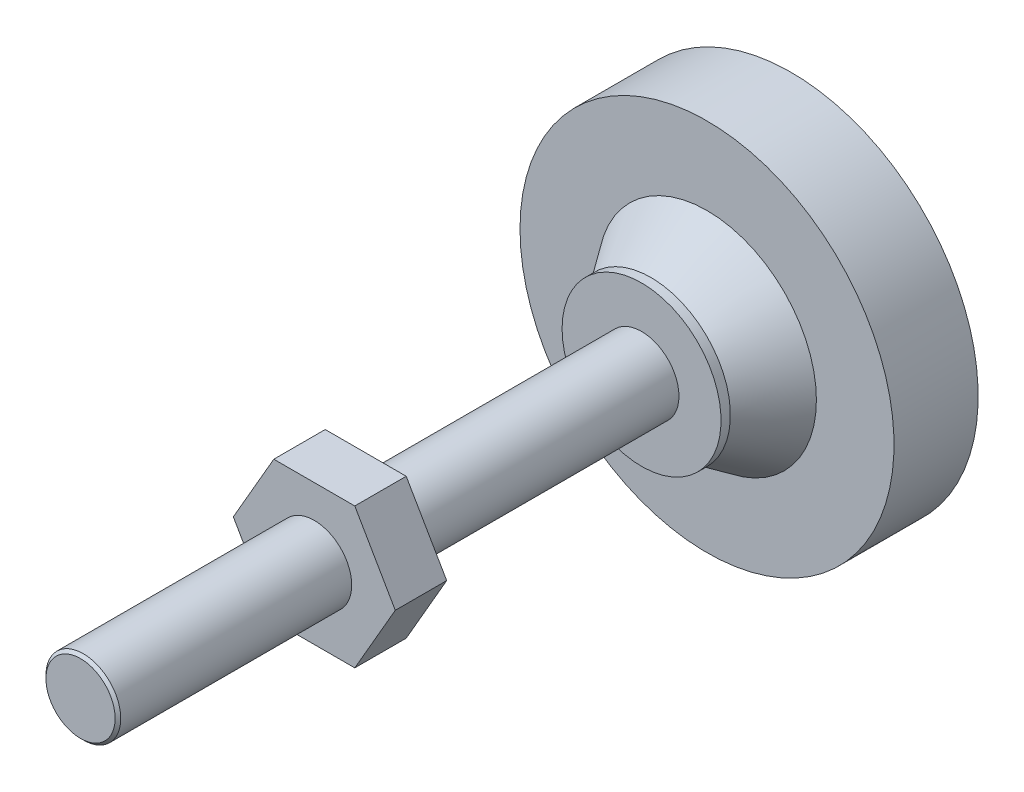
ISO-10303-21;
HEADER;
FILE_DESCRIPTION(('STEP AP214'),'2;1');
FILE_NAME('part.step','',(''),(''),'','','');
FILE_SCHEMA(('AUTOMOTIVE_DESIGN { 1 0 10303 214 1 1 1 1 }'));
ENDSEC;
DATA;
#1=APPLICATION_CONTEXT('core data for automotive mechanical design processes');
#2=APPLICATION_PROTOCOL_DEFINITION('international standard','automotive_design',2000,#1);
#3=PRODUCT_CONTEXT('',#1,'mechanical');
#4=PRODUCT('Part','Part','',(#3));
#5=PRODUCT_RELATED_PRODUCT_CATEGORY('part','',(#4));
#6=PRODUCT_DEFINITION_FORMATION('','',#4);
#7=PRODUCT_DEFINITION_CONTEXT('part definition',#1,'design');
#8=PRODUCT_DEFINITION('design','',#6,#7);
#9=PRODUCT_DEFINITION_SHAPE('','',#8);
#10=(LENGTH_UNIT() NAMED_UNIT(*) SI_UNIT(.MILLI.,.METRE.));
#11=(NAMED_UNIT(*) PLANE_ANGLE_UNIT() SI_UNIT($,.RADIAN.));
#12=(NAMED_UNIT(*) SI_UNIT($,.STERADIAN.) SOLID_ANGLE_UNIT());
#13=UNCERTAINTY_MEASURE_WITH_UNIT(LENGTH_MEASURE(1.E-05),#10,'distance_accuracy_value','');
#14=(GEOMETRIC_REPRESENTATION_CONTEXT(3) GLOBAL_UNCERTAINTY_ASSIGNED_CONTEXT((#13)) GLOBAL_UNIT_ASSIGNED_CONTEXT((#10,
#11,#12)) REPRESENTATION_CONTEXT('',''));
#15=CARTESIAN_POINT('',(0.,0.,0.));
#16=DIRECTION('',(0.,0.,1.));
#17=DIRECTION('',(1.,0.,0.));
#18=AXIS2_PLACEMENT_3D('',#15,#16,#17);
#19=CARTESIAN_POINT('',(0.,0.,-7.));
#20=DIRECTION('',(0.,0.,1.));
#21=DIRECTION('',(1.,0.,0.));
#22=AXIS2_PLACEMENT_3D('',#19,#20,#21);
#23=PLANE('',#22);
#24=CARTESIAN_POINT('',(0.,0.,-7.));
#25=DIRECTION('',(0.,0.,-1.));
#26=DIRECTION('',(1.,0.,0.));
#27=AXIS2_PLACEMENT_3D('',#24,#25,#26);
#28=CIRCLE('',#27,8.5);
#29=CARTESIAN_POINT('',(-8.5,0.,-7.));
#30=VERTEX_POINT('',#29);
#31=EDGE_CURVE('E10',#30,#30,#28,.T.);
#32=ORIENTED_EDGE('',*,*,#31,.T.);
#33=EDGE_LOOP('',(#32));
#34=FACE_BOUND('',#33,.T.);
#35=CARTESIAN_POINT('',(0.,0.,-7.));
#36=DIRECTION('',(0.,0.,1.));
#37=DIRECTION('',(1.,0.,0.));
#38=AXIS2_PLACEMENT_3D('',#35,#36,#37);
#39=CIRCLE('',#38,7.5);
#40=CARTESIAN_POINT('',(7.5,0.,-7.));
#41=VERTEX_POINT('',#40);
#42=EDGE_CURVE('E139',#41,#41,#39,.T.);
#43=ORIENTED_EDGE('',*,*,#42,.T.);
#44=EDGE_LOOP('',(#43));
#45=FACE_BOUND('',#44,.T.);
#46=ADVANCED_FACE('F16',(#34,#45),#23,.F.);
#47=CARTESIAN_POINT('',(0.,0.,-6.));
#48=DIRECTION('',(0.,0.,1.));
#49=DIRECTION('',(1.,0.,0.));
#50=AXIS2_PLACEMENT_3D('',#47,#48,#49);
#51=CYLINDRICAL_SURFACE('',#50,8.5);
#52=CARTESIAN_POINT('',(0.,0.,-6.));
#53=DIRECTION('',(0.,0.,1.));
#54=DIRECTION('',(1.,0.,0.));
#55=AXIS2_PLACEMENT_3D('',#52,#53,#54);
#56=CIRCLE('',#55,8.5);
#57=CARTESIAN_POINT('',(-8.5,0.,-6.));
#58=VERTEX_POINT('',#57);
#59=EDGE_CURVE('E27',#58,#58,#56,.T.);
#60=ORIENTED_EDGE('',*,*,#59,.F.);
#61=EDGE_LOOP('',(#60));
#62=FACE_BOUND('',#61,.T.);
#63=ORIENTED_EDGE('',*,*,#31,.F.);
#64=EDGE_LOOP('',(#63));
#65=FACE_BOUND('',#64,.T.);
#66=ADVANCED_FACE('F223',(#62,#65),#51,.T.);
#67=CARTESIAN_POINT('',(0.,0.,-6.));
#68=DIRECTION('',(0.,0.,1.));
#69=DIRECTION('',(1.,0.,0.));
#70=AXIS2_PLACEMENT_3D('',#67,#68,#69);
#71=PLANE('',#70);
#72=ORIENTED_EDGE('',*,*,#59,.T.);
#73=EDGE_LOOP('',(#72));
#74=FACE_BOUND('',#73,.T.);
#75=CARTESIAN_POINT('',(0.,0.,-6.));
#76=DIRECTION('',(0.,0.,1.));
#77=DIRECTION('',(-1.,0.,0.));
#78=AXIS2_PLACEMENT_3D('',#75,#76,#77);
#79=CIRCLE('',#78,4.);
#80=CARTESIAN_POINT('',(4.,0.,-6.));
#81=VERTEX_POINT('',#80);
#82=EDGE_CURVE('E198',#81,#81,#79,.T.);
#83=ORIENTED_EDGE('',*,*,#82,.F.);
#84=EDGE_LOOP('',(#83));
#85=FACE_BOUND('',#84,.T.);
#86=ADVANCED_FACE('F228',(#74,#85),#71,.T.);
#87=CARTESIAN_POINT('',(0.,0.,-17.));
#88=DIRECTION('',(0.,0.,-1.));
#89=DIRECTION('',(1.,0.,0.));
#90=AXIS2_PLACEMENT_3D('',#87,#88,#89);
#91=CONICAL_SURFACE('',#90,14.5,0.610725964389208);
#92=ORIENTED_EDGE('',*,*,#42,.F.);
#93=EDGE_LOOP('',(#92));
#94=FACE_BOUND('',#93,.T.);
#95=CARTESIAN_POINT('',(0.,0.,-13.));
#96=DIRECTION('',(0.,0.,1.));
#97=DIRECTION('',(1.,0.,0.));
#98=AXIS2_PLACEMENT_3D('',#95,#96,#97);
#99=CIRCLE('',#98,11.7);
#100=CARTESIAN_POINT('',(-11.7,0.,-13.));
#101=VERTEX_POINT('',#100);
#102=EDGE_CURVE('E181',#101,#101,#99,.T.);
#103=ORIENTED_EDGE('',*,*,#102,.T.);
#104=EDGE_LOOP('',(#103));
#105=FACE_BOUND('',#104,.T.);
#106=ADVANCED_FACE('F237',(#94,#105),#91,.T.);
#107=CARTESIAN_POINT('',(0.,0.,54.));
#108=DIRECTION('',(0.,0.,1.));
#109=DIRECTION('',(1.,0.,0.));
#110=AXIS2_PLACEMENT_3D('',#107,#108,#109);
#111=PLANE('',#110);
#112=CARTESIAN_POINT('',(0.,0.,54.));
#113=DIRECTION('',(0.,0.,-1.));
#114=DIRECTION('',(-1.,0.,0.));
#115=AXIS2_PLACEMENT_3D('',#112,#113,#114);
#116=CIRCLE('',#115,3.7);
#117=CARTESIAN_POINT('',(3.7,0.,54.));
#118=VERTEX_POINT('',#117);
#119=EDGE_CURVE('E20',#118,#118,#116,.T.);
#120=ORIENTED_EDGE('',*,*,#119,.F.);
#121=EDGE_LOOP('',(#120));
#122=FACE_BOUND('',#121,.T.);
#123=ADVANCED_FACE('F255',(#122),#111,.T.);
#124=CARTESIAN_POINT('',(0.,0.,0.));
#125=DIRECTION('',(0.,0.,-1.));
#126=DIRECTION('',(-1.,0.,0.));
#127=AXIS2_PLACEMENT_3D('',#124,#125,#126);
#128=CYLINDRICAL_SURFACE('',#127,4.);
#129=ORIENTED_EDGE('',*,*,#82,.T.);
#130=EDGE_LOOP('',(#129));
#131=FACE_BOUND('',#130,.T.);
#132=CARTESIAN_POINT('',(0.,0.,23.5));
#133=DIRECTION('',(0.,0.,-1.));
#134=DIRECTION('',(-1.,0.,0.));
#135=AXIS2_PLACEMENT_3D('',#132,#133,#134);
#136=CIRCLE('',#135,4.);
#137=CARTESIAN_POINT('',(4.,0.,23.5));
#138=VERTEX_POINT('',#137);
#139=EDGE_CURVE('E158',#138,#138,#136,.T.);
#140=ORIENTED_EDGE('',*,*,#139,.T.);
#141=EDGE_LOOP('',(#140));
#142=FACE_BOUND('',#141,.T.);
#143=ADVANCED_FACE('F249',(#131,#142),#128,.T.);
#144=CARTESIAN_POINT('',(0.,0.,53.85));
#145=DIRECTION('',(0.,0.,-1.));
#146=DIRECTION('',(-1.,0.,0.));
#147=AXIS2_PLACEMENT_3D('',#144,#145,#146);
#148=CONICAL_SURFACE('',#147,3.85,0.785398163397445);
#149=ORIENTED_EDGE('',*,*,#119,.T.);
#150=EDGE_LOOP('',(#149));
#151=FACE_BOUND('',#150,.T.);
#152=CARTESIAN_POINT('',(0.,0.,53.7));
#153=DIRECTION('',(0.,0.,1.));
#154=DIRECTION('',(-1.,0.,0.));
#155=AXIS2_PLACEMENT_3D('',#152,#153,#154);
#156=CIRCLE('',#155,4.);
#157=CARTESIAN_POINT('',(4.,0.,53.7));
#158=VERTEX_POINT('',#157);
#159=EDGE_CURVE('E173',#158,#158,#156,.T.);
#160=ORIENTED_EDGE('',*,*,#159,.T.);
#161=EDGE_LOOP('',(#160));
#162=FACE_BOUND('',#161,.T.);
#163=ADVANCED_FACE('F246',(#151,#162),#148,.T.);
#164=CARTESIAN_POINT('',(0.,0.,-17.));
#165=DIRECTION('',(0.,0.,-1.));
#166=DIRECTION('',(1.,0.,0.));
#167=AXIS2_PLACEMENT_3D('',#164,#165,#166);
#168=CYLINDRICAL_SURFACE('',#167,20.);
#169=CARTESIAN_POINT('',(0.,0.,-13.));
#170=DIRECTION('',(0.,0.,1.));
#171=DIRECTION('',(1.,0.,0.));
#172=AXIS2_PLACEMENT_3D('',#169,#170,#171);
#173=CIRCLE('',#172,20.);
#174=CARTESIAN_POINT('',(-20.,0.,-13.));
#175=VERTEX_POINT('',#174);
#176=EDGE_CURVE('E178',#175,#175,#173,.T.);
#177=ORIENTED_EDGE('',*,*,#176,.F.);
#178=EDGE_LOOP('',(#177));
#179=FACE_BOUND('',#178,.T.);
#180=CARTESIAN_POINT('',(0.,0.,-22.));
#181=DIRECTION('',(0.,0.,-1.));
#182=DIRECTION('',(1.,0.,0.));
#183=AXIS2_PLACEMENT_3D('',#180,#181,#182);
#184=CIRCLE('',#183,20.);
#185=CARTESIAN_POINT('',(-20.,0.,-22.));
#186=VERTEX_POINT('',#185);
#187=EDGE_CURVE('E195',#186,#186,#184,.T.);
#188=ORIENTED_EDGE('',*,*,#187,.F.);
#189=EDGE_LOOP('',(#188));
#190=FACE_BOUND('',#189,.T.);
#191=ADVANCED_FACE('F234',(#179,#190),#168,.T.);
#192=CARTESIAN_POINT('',(0.,0.,-22.));
#193=DIRECTION('',(0.,0.,1.));
#194=DIRECTION('',(1.,0.,0.));
#195=AXIS2_PLACEMENT_3D('',#192,#193,#194);
#196=PLANE('',#195);
#197=ORIENTED_EDGE('',*,*,#187,.T.);
#198=EDGE_LOOP('',(#197));
#199=FACE_BOUND('',#198,.T.);
#200=CARTESIAN_POINT('',(0.,0.,-22.));
#201=DIRECTION('',(0.,0.,1.));
#202=DIRECTION('',(1.,0.,0.));
#203=AXIS2_PLACEMENT_3D('',#200,#201,#202);
#204=CIRCLE('',#203,8.);
#205=CARTESIAN_POINT('',(-8.,0.,-22.));
#206=VERTEX_POINT('',#205);
#207=EDGE_CURVE('E176',#206,#206,#204,.T.);
#208=ORIENTED_EDGE('',*,*,#207,.T.);
#209=EDGE_LOOP('',(#208));
#210=FACE_BOUND('',#209,.T.);
#211=ADVANCED_FACE('F268',(#199,#210),#196,.F.);
#212=CARTESIAN_POINT('',(0.,0.,-13.));
#213=DIRECTION('',(0.,0.,1.));
#214=DIRECTION('',(1.,0.,0.));
#215=AXIS2_PLACEMENT_3D('',#212,#213,#214);
#216=PLANE('',#215);
#217=ORIENTED_EDGE('',*,*,#102,.F.);
#218=EDGE_LOOP('',(#217));
#219=FACE_BOUND('',#218,.T.);
#220=ORIENTED_EDGE('',*,*,#176,.T.);
#221=EDGE_LOOP('',(#220));
#222=FACE_BOUND('',#221,.T.);
#223=ADVANCED_FACE('F271',(#219,#222),#216,.T.);
#224=CARTESIAN_POINT('',(0.,0.,-10.));
#225=DIRECTION('',(0.,0.,1.));
#226=DIRECTION('',(1.,0.,0.));
#227=AXIS2_PLACEMENT_3D('',#224,#225,#226);
#228=PLANE('',#227);
#229=CARTESIAN_POINT('',(0.,0.,-10.));
#230=DIRECTION('',(0.,0.,1.));
#231=DIRECTION('',(1.,0.,0.));
#232=AXIS2_PLACEMENT_3D('',#229,#230,#231);
#233=CIRCLE('',#232,8.);
#234=CARTESIAN_POINT('',(-8.,0.,-10.));
#235=VERTEX_POINT('',#234);
#236=EDGE_CURVE('E175',#235,#235,#233,.T.);
#237=ORIENTED_EDGE('',*,*,#236,.F.);
#238=EDGE_LOOP('',(#237));
#239=FACE_BOUND('',#238,.T.);
#240=ADVANCED_FACE('F241',(#239),#228,.F.);
#241=CARTESIAN_POINT('',(0.,0.,-22.));
#242=DIRECTION('',(0.,0.,-1.));
#243=DIRECTION('',(1.,0.,0.));
#244=AXIS2_PLACEMENT_3D('',#241,#242,#243);
#245=CYLINDRICAL_SURFACE('',#244,8.);
#246=ORIENTED_EDGE('',*,*,#207,.F.);
#247=EDGE_LOOP('',(#246));
#248=FACE_BOUND('',#247,.T.);
#249=ORIENTED_EDGE('',*,*,#236,.T.);
#250=EDGE_LOOP('',(#249));
#251=FACE_BOUND('',#250,.T.);
#252=ADVANCED_FACE('F220',(#248,#251),#245,.F.);
#253=CARTESIAN_POINT('',(0.,0.,0.));
#254=DIRECTION('',(0.,0.,-1.));
#255=DIRECTION('',(-1.,0.,0.));
#256=AXIS2_PLACEMENT_3D('',#253,#254,#255);
#257=CYLINDRICAL_SURFACE('',#256,4.);
#258=CARTESIAN_POINT('',(0.,0.,29.));
#259=DIRECTION('',(0.,0.,1.));
#260=DIRECTION('',(-1.,0.,0.));
#261=AXIS2_PLACEMENT_3D('',#258,#259,#260);
#262=CIRCLE('',#261,4.);
#263=CARTESIAN_POINT('',(4.,0.,29.));
#264=VERTEX_POINT('',#263);
#265=EDGE_CURVE('E170',#264,#264,#262,.T.);
#266=ORIENTED_EDGE('',*,*,#265,.T.);
#267=EDGE_LOOP('',(#266));
#268=FACE_BOUND('',#267,.T.);
#269=ORIENTED_EDGE('',*,*,#159,.F.);
#270=EDGE_LOOP('',(#269));
#271=FACE_BOUND('',#270,.T.);
#272=ADVANCED_FACE('F210',(#268,#271),#257,.T.);
#273=CARTESIAN_POINT('',(0.,0.,29.));
#274=DIRECTION('',(0.,0.,1.));
#275=DIRECTION('',(1.,0.,0.));
#276=AXIS2_PLACEMENT_3D('',#273,#274,#275);
#277=PLANE('',#276);
#278=DIRECTION('',(-0.5,-0.866025403784439,0.));
#279=VECTOR('',#278,1.);
#280=CARTESIAN_POINT('',(8.66025403784439,0.,29.));
#281=LINE('',#280,#279);
#282=CARTESIAN_POINT('',(8.66025403784439,0.,29.));
#283=VERTEX_POINT('',#282);
#284=CARTESIAN_POINT('',(4.3301270189222,-7.5,29.));
#285=VERTEX_POINT('',#284);
#286=EDGE_CURVE('E104',#283,#285,#281,.T.);
#287=ORIENTED_EDGE('',*,*,#286,.F.);
#288=DIRECTION('',(0.5,-0.866025403784439,0.));
#289=VECTOR('',#288,1.);
#290=CARTESIAN_POINT('',(4.33012701892219,7.5,29.));
#291=LINE('',#290,#289);
#292=CARTESIAN_POINT('',(4.33012701892219,7.5,29.));
#293=VERTEX_POINT('',#292);
#294=EDGE_CURVE('E109',#293,#283,#291,.T.);
#295=ORIENTED_EDGE('',*,*,#294,.F.);
#296=DIRECTION('',(1.,0.,0.));
#297=VECTOR('',#296,1.);
#298=CARTESIAN_POINT('',(-4.3301270189222,7.5,29.));
#299=LINE('',#298,#297);
#300=CARTESIAN_POINT('',(-4.3301270189222,7.5,29.));
#301=VERTEX_POINT('',#300);
#302=EDGE_CURVE('E144',#301,#293,#299,.T.);
#303=ORIENTED_EDGE('',*,*,#302,.F.);
#304=DIRECTION('',(0.5,0.866025403784439,0.));
#305=VECTOR('',#304,1.);
#306=CARTESIAN_POINT('',(-8.66025403784439,0.,29.));
#307=LINE('',#306,#305);
#308=CARTESIAN_POINT('',(-8.66025403784439,0.,29.));
#309=VERTEX_POINT('',#308);
#310=EDGE_CURVE('E155',#309,#301,#307,.T.);
#311=ORIENTED_EDGE('',*,*,#310,.F.);
#312=DIRECTION('',(-0.5,0.866025403784439,0.));
#313=VECTOR('',#312,1.);
#314=CARTESIAN_POINT('',(-4.33012701892219,-7.5,29.));
#315=LINE('',#314,#313);
#316=CARTESIAN_POINT('',(-4.33012701892219,-7.5,29.));
#317=VERTEX_POINT('',#316);
#318=EDGE_CURVE('E68',#317,#309,#315,.T.);
#319=ORIENTED_EDGE('',*,*,#318,.F.);
#320=DIRECTION('',(-1.,0.,0.));
#321=VECTOR('',#320,1.);
#322=CARTESIAN_POINT('',(4.3301270189222,-7.5,29.));
#323=LINE('',#322,#321);
#324=EDGE_CURVE('E110',#285,#317,#323,.T.);
#325=ORIENTED_EDGE('',*,*,#324,.F.);
#326=EDGE_LOOP('',(#287,#295,#303,#311,#319,#325));
#327=FACE_BOUND('',#326,.T.);
#328=ORIENTED_EDGE('',*,*,#265,.F.);
#329=EDGE_LOOP('',(#328));
#330=FACE_BOUND('',#329,.T.);
#331=ADVANCED_FACE('F18',(#327,#330),#277,.T.);
#332=CARTESIAN_POINT('',(0.,0.,23.5));
#333=DIRECTION('',(0.,0.,-1.));
#334=DIRECTION('',(-1.,0.,0.));
#335=AXIS2_PLACEMENT_3D('',#332,#333,#334);
#336=PLANE('',#335);
#337=DIRECTION('',(-0.5,-0.866025403784439,0.));
#338=VECTOR('',#337,1.);
#339=CARTESIAN_POINT('',(8.66025403784439,0.,23.5));
#340=LINE('',#339,#338);
#341=CARTESIAN_POINT('',(8.66025403784439,0.,23.5));
#342=VERTEX_POINT('',#341);
#343=CARTESIAN_POINT('',(4.3301270189222,-7.5,23.5));
#344=VERTEX_POINT('',#343);
#345=EDGE_CURVE('E115',#342,#344,#340,.T.);
#346=ORIENTED_EDGE('',*,*,#345,.T.);
#347=DIRECTION('',(-1.,0.,0.));
#348=VECTOR('',#347,1.);
#349=CARTESIAN_POINT('',(4.3301270189222,-7.5,23.5));
#350=LINE('',#349,#348);
#351=CARTESIAN_POINT('',(-4.33012701892219,-7.5,23.5));
#352=VERTEX_POINT('',#351);
#353=EDGE_CURVE('E147',#344,#352,#350,.T.);
#354=ORIENTED_EDGE('',*,*,#353,.T.);
#355=DIRECTION('',(-0.5,0.866025403784439,0.));
#356=VECTOR('',#355,1.);
#357=CARTESIAN_POINT('',(-4.33012701892219,-7.5,23.5));
#358=LINE('',#357,#356);
#359=CARTESIAN_POINT('',(-8.66025403784439,0.,23.5));
#360=VERTEX_POINT('',#359);
#361=EDGE_CURVE('E168',#352,#360,#358,.T.);
#362=ORIENTED_EDGE('',*,*,#361,.T.);
#363=DIRECTION('',(0.5,0.866025403784439,0.));
#364=VECTOR('',#363,1.);
#365=CARTESIAN_POINT('',(-8.66025403784439,0.,23.5));
#366=LINE('',#365,#364);
#367=CARTESIAN_POINT('',(-4.3301270189222,7.5,23.5));
#368=VERTEX_POINT('',#367);
#369=EDGE_CURVE('E78',#360,#368,#366,.T.);
#370=ORIENTED_EDGE('',*,*,#369,.T.);
#371=DIRECTION('',(1.,0.,0.));
#372=VECTOR('',#371,1.);
#373=CARTESIAN_POINT('',(-4.3301270189222,7.5,23.5));
#374=LINE('',#373,#372);
#375=CARTESIAN_POINT('',(4.33012701892219,7.5,23.5));
#376=VERTEX_POINT('',#375);
#377=EDGE_CURVE('E141',#368,#376,#374,.T.);
#378=ORIENTED_EDGE('',*,*,#377,.T.);
#379=DIRECTION('',(0.5,-0.866025403784439,0.));
#380=VECTOR('',#379,1.);
#381=CARTESIAN_POINT('',(4.33012701892219,7.5,23.5));
#382=LINE('',#381,#380);
#383=EDGE_CURVE('E125',#376,#342,#382,.T.);
#384=ORIENTED_EDGE('',*,*,#383,.T.);
#385=EDGE_LOOP('',(#346,#354,#362,#370,#378,#384));
#386=FACE_BOUND('',#385,.T.);
#387=ORIENTED_EDGE('',*,*,#139,.F.);
#388=EDGE_LOOP('',(#387));
#389=FACE_BOUND('',#388,.T.);
#390=ADVANCED_FACE('F213',(#386,#389),#336,.T.);
#391=CARTESIAN_POINT('',(8.66025403784439,0.,29.));
#392=DIRECTION('',(0.866025403784439,-0.5,0.));
#393=DIRECTION('',(-0.5,-0.866025403784439,0.));
#394=AXIS2_PLACEMENT_3D('',#391,#392,#393);
#395=PLANE('',#394);
#396=ORIENTED_EDGE('',*,*,#286,.T.);
#397=DIRECTION('',(0.,0.,-1.));
#398=VECTOR('',#397,1.);
#399=CARTESIAN_POINT('',(4.3301270189222,-7.5,29.));
#400=LINE('',#399,#398);
#401=EDGE_CURVE('E116',#285,#344,#400,.T.);
#402=ORIENTED_EDGE('',*,*,#401,.T.);
#403=ORIENTED_EDGE('',*,*,#345,.F.);
#404=DIRECTION('',(0.,0.,-1.));
#405=VECTOR('',#404,1.);
#406=CARTESIAN_POINT('',(8.66025403784439,0.,29.));
#407=LINE('',#406,#405);
#408=EDGE_CURVE('E119',#283,#342,#407,.T.);
#409=ORIENTED_EDGE('',*,*,#408,.F.);
#410=EDGE_LOOP('',(#396,#402,#403,#409));
#411=FACE_BOUND('',#410,.T.);
#412=ADVANCED_FACE('F120',(#411),#395,.T.);
#413=CARTESIAN_POINT('',(4.3301270189222,-7.5,29.));
#414=DIRECTION('',(0.,-1.,0.));
#415=DIRECTION('',(-1.,0.,0.));
#416=AXIS2_PLACEMENT_3D('',#413,#414,#415);
#417=PLANE('',#416);
#418=ORIENTED_EDGE('',*,*,#324,.T.);
#419=DIRECTION('',(0.,0.,-1.));
#420=VECTOR('',#419,1.);
#421=CARTESIAN_POINT('',(-4.33012701892219,-7.5,29.));
#422=LINE('',#421,#420);
#423=EDGE_CURVE('E164',#317,#352,#422,.T.);
#424=ORIENTED_EDGE('',*,*,#423,.T.);
#425=ORIENTED_EDGE('',*,*,#353,.F.);
#426=ORIENTED_EDGE('',*,*,#401,.F.);
#427=EDGE_LOOP('',(#418,#424,#425,#426));
#428=FACE_BOUND('',#427,.T.);
#429=ADVANCED_FACE('F245',(#428),#417,.T.);
#430=CARTESIAN_POINT('',(-4.33012701892219,-7.5,29.));
#431=DIRECTION('',(-0.866025403784439,-0.5,0.));
#432=DIRECTION('',(-0.5,0.866025403784439,0.));
#433=AXIS2_PLACEMENT_3D('',#430,#431,#432);
#434=PLANE('',#433);
#435=ORIENTED_EDGE('',*,*,#318,.T.);
#436=DIRECTION('',(0.,0.,-1.));
#437=VECTOR('',#436,1.);
#438=CARTESIAN_POINT('',(-8.66025403784439,0.,29.));
#439=LINE('',#438,#437);
#440=EDGE_CURVE('E163',#309,#360,#439,.T.);
#441=ORIENTED_EDGE('',*,*,#440,.T.);
#442=ORIENTED_EDGE('',*,*,#361,.F.);
#443=ORIENTED_EDGE('',*,*,#423,.F.);
#444=EDGE_LOOP('',(#435,#441,#442,#443));
#445=FACE_BOUND('',#444,.T.);
#446=ADVANCED_FACE('F264',(#445),#434,.T.);
#447=CARTESIAN_POINT('',(-8.66025403784439,0.,29.));
#448=DIRECTION('',(-0.866025403784439,0.5,0.));
#449=DIRECTION('',(0.5,0.866025403784439,0.));
#450=AXIS2_PLACEMENT_3D('',#447,#448,#449);
#451=PLANE('',#450);
#452=ORIENTED_EDGE('',*,*,#310,.T.);
#453=DIRECTION('',(0.,0.,-1.));
#454=VECTOR('',#453,1.);
#455=CARTESIAN_POINT('',(-4.3301270189222,7.5,29.));
#456=LINE('',#455,#454);
#457=EDGE_CURVE('E143',#301,#368,#456,.T.);
#458=ORIENTED_EDGE('',*,*,#457,.T.);
#459=ORIENTED_EDGE('',*,*,#369,.F.);
#460=ORIENTED_EDGE('',*,*,#440,.F.);
#461=EDGE_LOOP('',(#452,#458,#459,#460));
#462=FACE_BOUND('',#461,.T.);
#463=ADVANCED_FACE('F267',(#462),#451,.T.);
#464=CARTESIAN_POINT('',(-4.3301270189222,7.5,29.));
#465=DIRECTION('',(0.,1.,0.));
#466=DIRECTION('',(1.,0.,0.));
#467=AXIS2_PLACEMENT_3D('',#464,#465,#466);
#468=PLANE('',#467);
#469=ORIENTED_EDGE('',*,*,#302,.T.);
#470=DIRECTION('',(0.,0.,-1.));
#471=VECTOR('',#470,1.);
#472=CARTESIAN_POINT('',(4.33012701892219,7.5,29.));
#473=LINE('',#472,#471);
#474=EDGE_CURVE('E130',#293,#376,#473,.T.);
#475=ORIENTED_EDGE('',*,*,#474,.T.);
#476=ORIENTED_EDGE('',*,*,#377,.F.);
#477=ORIENTED_EDGE('',*,*,#457,.F.);
#478=EDGE_LOOP('',(#469,#475,#476,#477));
#479=FACE_BOUND('',#478,.T.);
#480=ADVANCED_FACE('F253',(#479),#468,.T.);
#481=CARTESIAN_POINT('',(4.33012701892219,7.5,29.));
#482=DIRECTION('',(0.866025403784439,0.5,0.));
#483=DIRECTION('',(0.5,-0.866025403784439,0.));
#484=AXIS2_PLACEMENT_3D('',#481,#482,#483);
#485=PLANE('',#484);
#486=ORIENTED_EDGE('',*,*,#294,.T.);
#487=ORIENTED_EDGE('',*,*,#408,.T.);
#488=ORIENTED_EDGE('',*,*,#383,.F.);
#489=ORIENTED_EDGE('',*,*,#474,.F.);
#490=EDGE_LOOP('',(#486,#487,#488,#489));
#491=FACE_BOUND('',#490,.T.);
#492=ADVANCED_FACE('F128',(#491),#485,.T.);
#493=CLOSED_SHELL('',(#46,#66,#86,#106,#123,#143,#163,#191,#211,#223,#240,#252,#272,#331,#390,
#412,#429,#446,#463,#480,#492));
#494=MANIFOLD_SOLID_BREP('B1',#493);
#495=ADVANCED_BREP_SHAPE_REPRESENTATION('',(#18,#494),#14);
#496=SHAPE_DEFINITION_REPRESENTATION(#9,#495);
ENDSEC;
END-ISO-10303-21;
